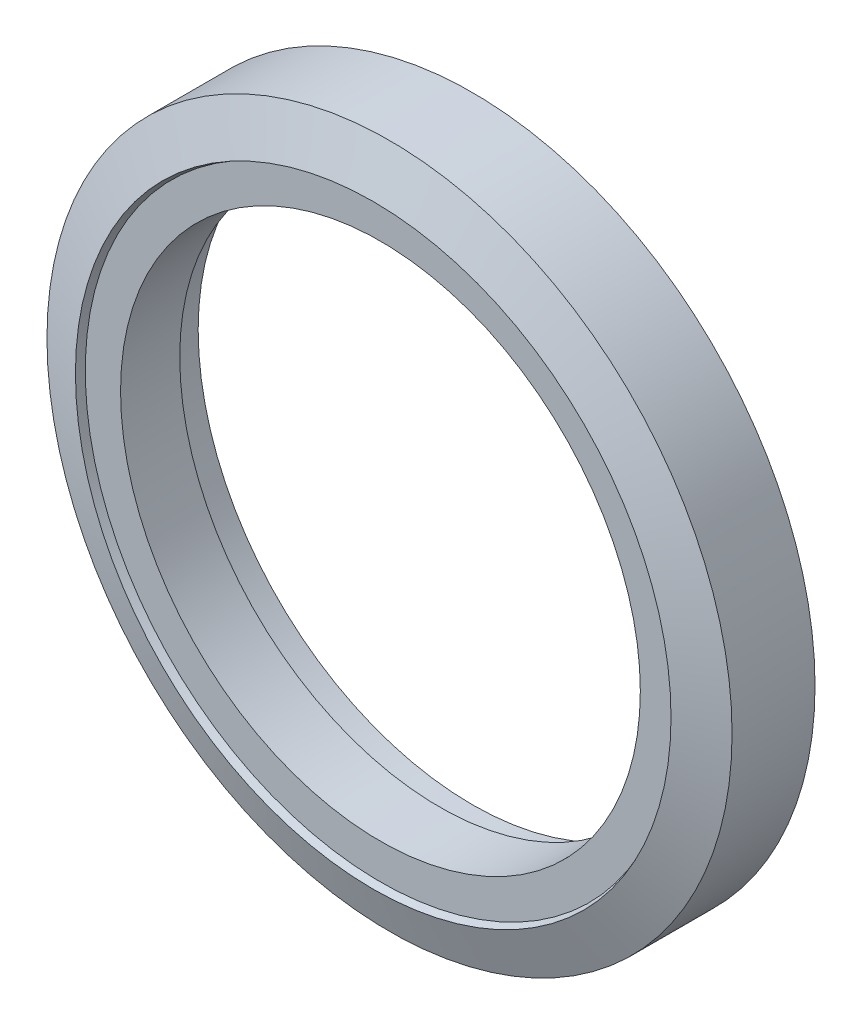
ISO-10303-21;
HEADER;
FILE_DESCRIPTION(('STEP AP214'),'2;1');
FILE_NAME('part.step','',(''),(''),'','','');
FILE_SCHEMA(('AUTOMOTIVE_DESIGN { 1 0 10303 214 1 1 1 1 }'));
ENDSEC;
DATA;
#1=APPLICATION_CONTEXT('core data for automotive mechanical design processes');
#2=APPLICATION_PROTOCOL_DEFINITION('international standard','automotive_design',2000,#1);
#3=PRODUCT_CONTEXT('',#1,'mechanical');
#4=PRODUCT('Part','Part','',(#3));
#5=PRODUCT_RELATED_PRODUCT_CATEGORY('part','',(#4));
#6=PRODUCT_DEFINITION_FORMATION('','',#4);
#7=PRODUCT_DEFINITION_CONTEXT('part definition',#1,'design');
#8=PRODUCT_DEFINITION('design','',#6,#7);
#9=PRODUCT_DEFINITION_SHAPE('','',#8);
#10=(LENGTH_UNIT() NAMED_UNIT(*) SI_UNIT(.MILLI.,.METRE.));
#11=(NAMED_UNIT(*) PLANE_ANGLE_UNIT() SI_UNIT($,.RADIAN.));
#12=(NAMED_UNIT(*) SI_UNIT($,.STERADIAN.) SOLID_ANGLE_UNIT());
#13=UNCERTAINTY_MEASURE_WITH_UNIT(LENGTH_MEASURE(1.E-05),#10,'distance_accuracy_value','');
#14=(GEOMETRIC_REPRESENTATION_CONTEXT(3) GLOBAL_UNCERTAINTY_ASSIGNED_CONTEXT((#13)) GLOBAL_UNIT_ASSIGNED_CONTEXT((#10,
#11,#12)) REPRESENTATION_CONTEXT('',''));
#15=CARTESIAN_POINT('',(0.,0.,0.));
#16=DIRECTION('',(0.,0.,1.));
#17=DIRECTION('',(1.,0.,0.));
#18=AXIS2_PLACEMENT_3D('',#15,#16,#17);
#19=CARTESIAN_POINT('',(0.,0.,3.4925));
#20=DIRECTION('',(0.,0.,1.));
#21=DIRECTION('',(0.,-1.,0.));
#22=AXIS2_PLACEMENT_3D('',#19,#20,#21);
#23=CYLINDRICAL_SURFACE('',#22,18.288);
#24=CARTESIAN_POINT('',(0.,0.,2.98449999999994));
#25=DIRECTION('',(0.,0.,-1.));
#26=DIRECTION('',(-1.,0.,0.));
#27=AXIS2_PLACEMENT_3D('',#24,#25,#26);
#28=CIRCLE('',#27,18.288);
#29=CARTESIAN_POINT('',(-18.288,0.,2.98449999999994));
#30=VERTEX_POINT('',#29);
#31=EDGE_CURVE('E84',#30,#30,#28,.T.);
#32=ORIENTED_EDGE('',*,*,#31,.F.);
#33=EDGE_LOOP('',(#32));
#34=FACE_BOUND('',#33,.T.);
#35=CARTESIAN_POINT('',(0.,0.,-1.1811));
#36=DIRECTION('',(0.,0.,1.));
#37=DIRECTION('',(1.,0.,0.));
#38=AXIS2_PLACEMENT_3D('',#35,#36,#37);
#39=CIRCLE('',#38,18.288);
#40=CARTESIAN_POINT('',(18.288,0.,-1.1811));
#41=VERTEX_POINT('',#40);
#42=EDGE_CURVE('E11',#41,#41,#39,.T.);
#43=ORIENTED_EDGE('',*,*,#42,.F.);
#44=EDGE_LOOP('',(#43));
#45=FACE_BOUND('',#44,.T.);
#46=ADVANCED_FACE('F17',(#34,#45),#23,.F.);
#47=CARTESIAN_POINT('',(0.,0.,-3.4925));
#48=DIRECTION('',(0.,0.,-1.));
#49=DIRECTION('',(0.,-1.,0.));
#50=AXIS2_PLACEMENT_3D('',#47,#48,#49);
#51=PLANE('',#50);
#52=CARTESIAN_POINT('',(0.,0.,-3.4925));
#53=DIRECTION('',(0.,0.,-1.));
#54=DIRECTION('',(-1.,0.,0.));
#55=AXIS2_PLACEMENT_3D('',#52,#53,#54);
#56=CIRCLE('',#55,19.304);
#57=CARTESIAN_POINT('',(-19.304,0.,-3.4925));
#58=VERTEX_POINT('',#57);
#59=EDGE_CURVE('E81',#58,#58,#56,.T.);
#60=ORIENTED_EDGE('',*,*,#59,.F.);
#61=EDGE_LOOP('',(#60));
#62=FACE_BOUND('',#61,.T.);
#63=CARTESIAN_POINT('',(0.,0.,-3.4925));
#64=DIRECTION('',(0.,0.,1.));
#65=DIRECTION('',(-1.,0.,0.));
#66=AXIS2_PLACEMENT_3D('',#63,#64,#65);
#67=CIRCLE('',#66,24.1046);
#68=CARTESIAN_POINT('',(-24.1046,0.,-3.4925));
#69=VERTEX_POINT('',#68);
#70=EDGE_CURVE('E68',#69,#69,#67,.T.);
#71=ORIENTED_EDGE('',*,*,#70,.F.);
#72=EDGE_LOOP('',(#71));
#73=FACE_BOUND('',#72,.T.);
#74=ADVANCED_FACE('F19',(#62,#73),#51,.T.);
#75=CARTESIAN_POINT('',(0.,0.,2.33689450620482));
#76=DIRECTION('',(0.,0.,-1.));
#77=DIRECTION('',(-1.,0.,0.));
#78=AXIS2_PLACEMENT_3D('',#75,#76,#77);
#79=CONICAL_SURFACE('',#78,24.13,1.22173047639603);
#80=CARTESIAN_POINT('',(0.,0.,3.4925));
#81=DIRECTION('',(0.,0.,1.));
#82=DIRECTION('',(1.,0.,0.));
#83=AXIS2_PLACEMENT_3D('',#80,#81,#82);
#84=CIRCLE('',#83,20.955);
#85=CARTESIAN_POINT('',(20.955,0.,3.4925));
#86=VERTEX_POINT('',#85);
#87=EDGE_CURVE('E21',#86,#86,#84,.T.);
#88=ORIENTED_EDGE('',*,*,#87,.F.);
#89=EDGE_LOOP('',(#88));
#90=FACE_BOUND('',#89,.T.);
#91=CARTESIAN_POINT('',(0.,0.,2.34613935015518));
#92=DIRECTION('',(0.,0.,-1.));
#93=DIRECTION('',(-1.,0.,0.));
#94=AXIS2_PLACEMENT_3D('',#91,#92,#93);
#95=CIRCLE('',#94,24.1046);
#96=CARTESIAN_POINT('',(-24.1046,0.,2.34613935015518));
#97=VERTEX_POINT('',#96);
#98=EDGE_CURVE('E72',#97,#97,#95,.T.);
#99=ORIENTED_EDGE('',*,*,#98,.F.);
#100=EDGE_LOOP('',(#99));
#101=FACE_BOUND('',#100,.T.);
#102=ADVANCED_FACE('F105',(#90,#101),#79,.T.);
#103=CARTESIAN_POINT('',(0.,0.,-1.1811));
#104=DIRECTION('',(0.,0.,1.));
#105=DIRECTION('',(1.,0.,0.));
#106=AXIS2_PLACEMENT_3D('',#103,#104,#105);
#107=PLANE('',#106);
#108=ORIENTED_EDGE('',*,*,#42,.T.);
#109=EDGE_LOOP('',(#108));
#110=FACE_BOUND('',#109,.T.);
#111=CARTESIAN_POINT('',(0.,0.,-1.1811));
#112=DIRECTION('',(0.,0.,-1.));
#113=DIRECTION('',(1.,0.,0.));
#114=AXIS2_PLACEMENT_3D('',#111,#112,#113);
#115=CIRCLE('',#114,19.304);
#116=CARTESIAN_POINT('',(19.304,0.,-1.1811));
#117=VERTEX_POINT('',#116);
#118=EDGE_CURVE('E73',#117,#117,#115,.T.);
#119=ORIENTED_EDGE('',*,*,#118,.T.);
#120=EDGE_LOOP('',(#119));
#121=FACE_BOUND('',#120,.T.);
#122=ADVANCED_FACE('F97',(#110,#121),#107,.F.);
#123=CARTESIAN_POINT('',(0.,0.,3.4925));
#124=DIRECTION('',(0.,0.,1.));
#125=DIRECTION('',(1.,0.,0.));
#126=AXIS2_PLACEMENT_3D('',#123,#124,#125);
#127=CONICAL_SURFACE('',#126,20.955,0.349065850398865);
#128=CARTESIAN_POINT('',(0.,0.,2.98449999999994));
#129=DIRECTION('',(0.,0.,1.));
#130=DIRECTION('',(1.,0.,0.));
#131=AXIS2_PLACEMENT_3D('',#128,#129,#130);
#132=CIRCLE('',#131,20.7701031209927);
#133=CARTESIAN_POINT('',(20.7701031209927,0.,2.98449999999994));
#134=VERTEX_POINT('',#133);
#135=EDGE_CURVE('E78',#134,#134,#132,.T.);
#136=ORIENTED_EDGE('',*,*,#135,.F.);
#137=EDGE_LOOP('',(#136));
#138=FACE_BOUND('',#137,.T.);
#139=ORIENTED_EDGE('',*,*,#87,.T.);
#140=EDGE_LOOP('',(#139));
#141=FACE_BOUND('',#140,.T.);
#142=ADVANCED_FACE('F95',(#138,#141),#127,.F.);
#143=CARTESIAN_POINT('',(0.,0.,2.98449999999994));
#144=DIRECTION('',(0.,0.,-1.));
#145=DIRECTION('',(0.,-1.,0.));
#146=AXIS2_PLACEMENT_3D('',#143,#144,#145);
#147=PLANE('',#146);
#148=ORIENTED_EDGE('',*,*,#31,.T.);
#149=EDGE_LOOP('',(#148));
#150=FACE_BOUND('',#149,.T.);
#151=ORIENTED_EDGE('',*,*,#135,.T.);
#152=EDGE_LOOP('',(#151));
#153=FACE_BOUND('',#152,.T.);
#154=ADVANCED_FACE('F93',(#150,#153),#147,.F.);
#155=CARTESIAN_POINT('',(0.,0.,3.4925));
#156=DIRECTION('',(0.,0.,1.));
#157=DIRECTION('',(-1.,0.,0.));
#158=AXIS2_PLACEMENT_3D('',#155,#156,#157);
#159=CYLINDRICAL_SURFACE('',#158,24.1046);
#160=ORIENTED_EDGE('',*,*,#98,.T.);
#161=EDGE_LOOP('',(#160));
#162=FACE_BOUND('',#161,.T.);
#163=ORIENTED_EDGE('',*,*,#70,.T.);
#164=EDGE_LOOP('',(#163));
#165=FACE_BOUND('',#164,.T.);
#166=ADVANCED_FACE('F69',(#162,#165),#159,.T.);
#167=CARTESIAN_POINT('',(0.,0.,-3.4925));
#168=DIRECTION('',(0.,0.,-1.));
#169=DIRECTION('',(0.,1.,0.));
#170=AXIS2_PLACEMENT_3D('',#167,#168,#169);
#171=CYLINDRICAL_SURFACE('',#170,19.304);
#172=ORIENTED_EDGE('',*,*,#118,.F.);
#173=EDGE_LOOP('',(#172));
#174=FACE_BOUND('',#173,.T.);
#175=ORIENTED_EDGE('',*,*,#59,.T.);
#176=EDGE_LOOP('',(#175));
#177=FACE_BOUND('',#176,.T.);
#178=ADVANCED_FACE('F118',(#174,#177),#171,.F.);
#179=CLOSED_SHELL('',(#46,#74,#102,#122,#142,#154,#166,#178));
#180=MANIFOLD_SOLID_BREP('B1',#179);
#181=ADVANCED_BREP_SHAPE_REPRESENTATION('',(#18,#180),#14);
#182=SHAPE_DEFINITION_REPRESENTATION(#9,#181);
ENDSEC;
END-ISO-10303-21;
